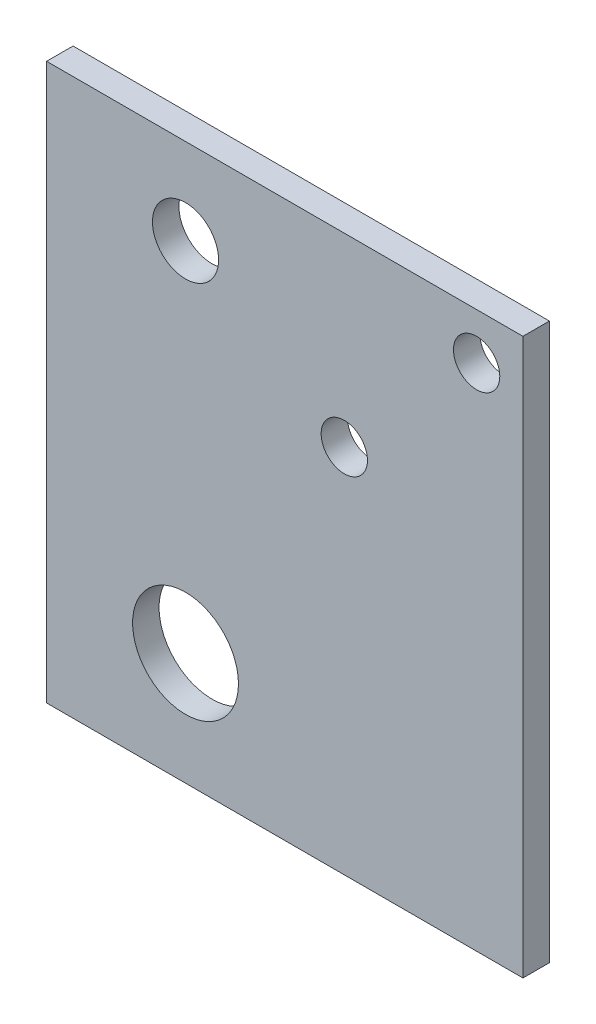
ISO-10303-21;
HEADER;
FILE_DESCRIPTION(('STEP AP214'),'2;1');
FILE_NAME('part.step','',(''),(''),'','','');
FILE_SCHEMA(('AUTOMOTIVE_DESIGN { 1 0 10303 214 1 1 1 1 }'));
ENDSEC;
DATA;
#1=APPLICATION_CONTEXT('core data for automotive mechanical design processes');
#2=APPLICATION_PROTOCOL_DEFINITION('international standard','automotive_design',2000,#1);
#3=PRODUCT_CONTEXT('',#1,'mechanical');
#4=PRODUCT('Part','Part','',(#3));
#5=PRODUCT_RELATED_PRODUCT_CATEGORY('part','',(#4));
#6=PRODUCT_DEFINITION_FORMATION('','',#4);
#7=PRODUCT_DEFINITION_CONTEXT('part definition',#1,'design');
#8=PRODUCT_DEFINITION('design','',#6,#7);
#9=PRODUCT_DEFINITION_SHAPE('','',#8);
#10=(LENGTH_UNIT() NAMED_UNIT(*) SI_UNIT(.MILLI.,.METRE.));
#11=(NAMED_UNIT(*) PLANE_ANGLE_UNIT() SI_UNIT($,.RADIAN.));
#12=(NAMED_UNIT(*) SI_UNIT($,.STERADIAN.) SOLID_ANGLE_UNIT());
#13=UNCERTAINTY_MEASURE_WITH_UNIT(LENGTH_MEASURE(1.E-05),#10,'distance_accuracy_value','');
#14=(GEOMETRIC_REPRESENTATION_CONTEXT(3) GLOBAL_UNCERTAINTY_ASSIGNED_CONTEXT((#13)) GLOBAL_UNIT_ASSIGNED_CONTEXT((#10,
#11,#12)) REPRESENTATION_CONTEXT('',''));
#15=CARTESIAN_POINT('',(0.,0.,0.));
#16=DIRECTION('',(0.,0.,1.));
#17=DIRECTION('',(1.,0.,0.));
#18=AXIS2_PLACEMENT_3D('',#15,#16,#17);
#19=CARTESIAN_POINT('',(0.,0.,2.));
#20=DIRECTION('',(1.,0.,0.));
#21=DIRECTION('',(0.,0.,-1.));
#22=AXIS2_PLACEMENT_3D('',#19,#20,#21);
#23=PLANE('',#22);
#24=DIRECTION('',(0.,-1.,0.));
#25=VECTOR('',#24,1.);
#26=CARTESIAN_POINT('',(0.,0.,0.));
#27=LINE('',#26,#25);
#28=CARTESIAN_POINT('',(0.,42.,0.));
#29=VERTEX_POINT('',#28);
#30=CARTESIAN_POINT('',(0.,0.,0.));
#31=VERTEX_POINT('',#30);
#32=EDGE_CURVE('E95',#29,#31,#27,.T.);
#33=ORIENTED_EDGE('',*,*,#32,.T.);
#34=DIRECTION('',(0.,0.,-1.));
#35=VECTOR('',#34,1.);
#36=CARTESIAN_POINT('',(0.,0.,2.));
#37=LINE('',#36,#35);
#38=CARTESIAN_POINT('',(0.,0.,2.));
#39=VERTEX_POINT('',#38);
#40=EDGE_CURVE('E11',#39,#31,#37,.T.);
#41=ORIENTED_EDGE('',*,*,#40,.F.);
#42=DIRECTION('',(0.,-1.,0.));
#43=VECTOR('',#42,1.);
#44=CARTESIAN_POINT('',(0.,0.,2.));
#45=LINE('',#44,#43);
#46=CARTESIAN_POINT('',(0.,42.,2.));
#47=VERTEX_POINT('',#46);
#48=EDGE_CURVE('E83',#47,#39,#45,.T.);
#49=ORIENTED_EDGE('',*,*,#48,.F.);
#50=DIRECTION('',(0.,0.,-1.));
#51=VECTOR('',#50,1.);
#52=CARTESIAN_POINT('',(0.,42.,2.));
#53=LINE('',#52,#51);
#54=EDGE_CURVE('E91',#47,#29,#53,.T.);
#55=ORIENTED_EDGE('',*,*,#54,.T.);
#56=EDGE_LOOP('',(#33,#41,#49,#55));
#57=FACE_BOUND('',#56,.T.);
#58=ADVANCED_FACE('F32',(#57),#23,.F.);
#59=CARTESIAN_POINT('',(0.,0.,2.));
#60=DIRECTION('',(0.,1.,0.));
#61=DIRECTION('',(0.,0.,1.));
#62=AXIS2_PLACEMENT_3D('',#59,#60,#61);
#63=PLANE('',#62);
#64=DIRECTION('',(1.,0.,0.));
#65=VECTOR('',#64,1.);
#66=CARTESIAN_POINT('',(0.,0.,0.));
#67=LINE('',#66,#65);
#68=CARTESIAN_POINT('',(36.,0.,0.));
#69=VERTEX_POINT('',#68);
#70=EDGE_CURVE('E87',#31,#69,#67,.T.);
#71=ORIENTED_EDGE('',*,*,#70,.T.);
#72=DIRECTION('',(0.,0.,-1.));
#73=VECTOR('',#72,1.);
#74=CARTESIAN_POINT('',(36.,0.,2.));
#75=LINE('',#74,#73);
#76=CARTESIAN_POINT('',(36.,0.,2.));
#77=VERTEX_POINT('',#76);
#78=EDGE_CURVE('E40',#77,#69,#75,.T.);
#79=ORIENTED_EDGE('',*,*,#78,.F.);
#80=DIRECTION('',(1.,0.,0.));
#81=VECTOR('',#80,1.);
#82=CARTESIAN_POINT('',(0.,0.,2.));
#83=LINE('',#82,#81);
#84=EDGE_CURVE('E78',#39,#77,#83,.T.);
#85=ORIENTED_EDGE('',*,*,#84,.F.);
#86=ORIENTED_EDGE('',*,*,#40,.T.);
#87=EDGE_LOOP('',(#71,#79,#85,#86));
#88=FACE_BOUND('',#87,.T.);
#89=ADVANCED_FACE('F86',(#88),#63,.F.);
#90=CARTESIAN_POINT('',(36.,0.,2.));
#91=DIRECTION('',(-1.,0.,0.));
#92=DIRECTION('',(0.,0.,1.));
#93=AXIS2_PLACEMENT_3D('',#90,#91,#92);
#94=PLANE('',#93);
#95=DIRECTION('',(0.,1.,0.));
#96=VECTOR('',#95,1.);
#97=CARTESIAN_POINT('',(36.,0.,0.));
#98=LINE('',#97,#96);
#99=CARTESIAN_POINT('',(36.,42.,0.));
#100=VERTEX_POINT('',#99);
#101=EDGE_CURVE('E65',#69,#100,#98,.T.);
#102=ORIENTED_EDGE('',*,*,#101,.T.);
#103=DIRECTION('',(0.,0.,-1.));
#104=VECTOR('',#103,1.);
#105=CARTESIAN_POINT('',(36.,42.,2.));
#106=LINE('',#105,#104);
#107=CARTESIAN_POINT('',(36.,42.,2.));
#108=VERTEX_POINT('',#107);
#109=EDGE_CURVE('E88',#108,#100,#106,.T.);
#110=ORIENTED_EDGE('',*,*,#109,.F.);
#111=DIRECTION('',(0.,1.,0.));
#112=VECTOR('',#111,1.);
#113=CARTESIAN_POINT('',(36.,0.,2.));
#114=LINE('',#113,#112);
#115=EDGE_CURVE('E81',#77,#108,#114,.T.);
#116=ORIENTED_EDGE('',*,*,#115,.F.);
#117=ORIENTED_EDGE('',*,*,#78,.T.);
#118=EDGE_LOOP('',(#102,#110,#116,#117));
#119=FACE_BOUND('',#118,.T.);
#120=ADVANCED_FACE('F89',(#119),#94,.F.);
#121=CARTESIAN_POINT('',(0.,42.,2.));
#122=DIRECTION('',(0.,-1.,0.));
#123=DIRECTION('',(0.,0.,-1.));
#124=AXIS2_PLACEMENT_3D('',#121,#122,#123);
#125=PLANE('',#124);
#126=DIRECTION('',(-1.,0.,0.));
#127=VECTOR('',#126,1.);
#128=CARTESIAN_POINT('',(0.,42.,0.));
#129=LINE('',#128,#127);
#130=EDGE_CURVE('E71',#100,#29,#129,.T.);
#131=ORIENTED_EDGE('',*,*,#130,.T.);
#132=ORIENTED_EDGE('',*,*,#54,.F.);
#133=DIRECTION('',(-1.,0.,0.));
#134=VECTOR('',#133,1.);
#135=CARTESIAN_POINT('',(0.,42.,2.));
#136=LINE('',#135,#134);
#137=EDGE_CURVE('E48',#108,#47,#136,.T.);
#138=ORIENTED_EDGE('',*,*,#137,.F.);
#139=ORIENTED_EDGE('',*,*,#109,.T.);
#140=EDGE_LOOP('',(#131,#132,#138,#139));
#141=FACE_BOUND('',#140,.T.);
#142=ADVANCED_FACE('F103',(#141),#125,.F.);
#143=CARTESIAN_POINT('',(0.,42.,2.));
#144=DIRECTION('',(0.,0.,-1.));
#145=DIRECTION('',(-1.,0.,0.));
#146=AXIS2_PLACEMENT_3D('',#143,#144,#145);
#147=PLANE('',#146);
#148=CARTESIAN_POINT('',(10.5000000000001,8.49999999999998,2.));
#149=DIRECTION('',(0.,0.,1.));
#150=DIRECTION('',(1.,0.,0.));
#151=AXIS2_PLACEMENT_3D('',#148,#149,#150);
#152=CIRCLE('',#151,4.);
#153=CARTESIAN_POINT('',(14.5000000000001,8.49999999999998,2.));
#154=VERTEX_POINT('',#153);
#155=EDGE_CURVE('E127',#154,#154,#152,.T.);
#156=ORIENTED_EDGE('',*,*,#155,.F.);
#157=EDGE_LOOP('',(#156));
#158=FACE_BOUND('',#157,.T.);
#159=CARTESIAN_POINT('',(10.5000000000001,35.5,2.));
#160=DIRECTION('',(0.,0.,1.));
#161=DIRECTION('',(1.,0.,0.));
#162=AXIS2_PLACEMENT_3D('',#159,#160,#161);
#163=CIRCLE('',#162,2.5);
#164=CARTESIAN_POINT('',(13.0000000000001,35.5,2.));
#165=VERTEX_POINT('',#164);
#166=EDGE_CURVE('E121',#165,#165,#163,.T.);
#167=ORIENTED_EDGE('',*,*,#166,.F.);
#168=EDGE_LOOP('',(#167));
#169=FACE_BOUND('',#168,.T.);
#170=CARTESIAN_POINT('',(22.5,28.,2.));
#171=DIRECTION('',(0.,0.,1.));
#172=DIRECTION('',(1.,0.,0.));
#173=AXIS2_PLACEMENT_3D('',#170,#171,#172);
#174=CIRCLE('',#173,1.75);
#175=CARTESIAN_POINT('',(24.25,28.,2.));
#176=VERTEX_POINT('',#175);
#177=EDGE_CURVE('E115',#176,#176,#174,.T.);
#178=ORIENTED_EDGE('',*,*,#177,.F.);
#179=EDGE_LOOP('',(#178));
#180=FACE_BOUND('',#179,.T.);
#181=CARTESIAN_POINT('',(32.5,38.5,2.));
#182=DIRECTION('',(0.,0.,1.));
#183=DIRECTION('',(1.,0.,0.));
#184=AXIS2_PLACEMENT_3D('',#181,#182,#183);
#185=CIRCLE('',#184,1.75);
#186=CARTESIAN_POINT('',(34.25,38.5,2.));
#187=VERTEX_POINT('',#186);
#188=EDGE_CURVE('E109',#187,#187,#185,.T.);
#189=ORIENTED_EDGE('',*,*,#188,.F.);
#190=EDGE_LOOP('',(#189));
#191=FACE_BOUND('',#190,.T.);
#192=ORIENTED_EDGE('',*,*,#48,.T.);
#193=ORIENTED_EDGE('',*,*,#84,.T.);
#194=ORIENTED_EDGE('',*,*,#115,.T.);
#195=ORIENTED_EDGE('',*,*,#137,.T.);
#196=EDGE_LOOP('',(#192,#193,#194,#195));
#197=FACE_BOUND('',#196,.T.);
#198=ADVANCED_FACE('F79',(#158,#169,#180,#191,#197),#147,.F.);
#199=CARTESIAN_POINT('',(0.,42.,0.));
#200=DIRECTION('',(0.,0.,-1.));
#201=DIRECTION('',(-1.,0.,0.));
#202=AXIS2_PLACEMENT_3D('',#199,#200,#201);
#203=PLANE('',#202);
#204=CARTESIAN_POINT('',(10.5000000000001,8.49999999999998,0.));
#205=DIRECTION('',(0.,0.,1.));
#206=DIRECTION('',(1.,0.,0.));
#207=AXIS2_PLACEMENT_3D('',#204,#205,#206);
#208=CIRCLE('',#207,4.);
#209=CARTESIAN_POINT('',(14.5000000000001,8.49999999999998,0.));
#210=VERTEX_POINT('',#209);
#211=EDGE_CURVE('E124',#210,#210,#208,.T.);
#212=ORIENTED_EDGE('',*,*,#211,.T.);
#213=EDGE_LOOP('',(#212));
#214=FACE_BOUND('',#213,.T.);
#215=CARTESIAN_POINT('',(10.5000000000001,35.5,0.));
#216=DIRECTION('',(0.,0.,1.));
#217=DIRECTION('',(1.,0.,0.));
#218=AXIS2_PLACEMENT_3D('',#215,#216,#217);
#219=CIRCLE('',#218,2.5);
#220=CARTESIAN_POINT('',(13.0000000000001,35.5,0.));
#221=VERTEX_POINT('',#220);
#222=EDGE_CURVE('E118',#221,#221,#219,.T.);
#223=ORIENTED_EDGE('',*,*,#222,.T.);
#224=EDGE_LOOP('',(#223));
#225=FACE_BOUND('',#224,.T.);
#226=CARTESIAN_POINT('',(22.5,28.,0.));
#227=DIRECTION('',(0.,0.,1.));
#228=DIRECTION('',(1.,0.,0.));
#229=AXIS2_PLACEMENT_3D('',#226,#227,#228);
#230=CIRCLE('',#229,1.75);
#231=CARTESIAN_POINT('',(24.25,28.,0.));
#232=VERTEX_POINT('',#231);
#233=EDGE_CURVE('E112',#232,#232,#230,.T.);
#234=ORIENTED_EDGE('',*,*,#233,.T.);
#235=EDGE_LOOP('',(#234));
#236=FACE_BOUND('',#235,.T.);
#237=CARTESIAN_POINT('',(32.5,38.5,0.));
#238=DIRECTION('',(0.,0.,1.));
#239=DIRECTION('',(1.,0.,0.));
#240=AXIS2_PLACEMENT_3D('',#237,#238,#239);
#241=CIRCLE('',#240,1.75);
#242=CARTESIAN_POINT('',(34.25,38.5,0.));
#243=VERTEX_POINT('',#242);
#244=EDGE_CURVE('E98',#243,#243,#241,.T.);
#245=ORIENTED_EDGE('',*,*,#244,.T.);
#246=EDGE_LOOP('',(#245));
#247=FACE_BOUND('',#246,.T.);
#248=ORIENTED_EDGE('',*,*,#32,.F.);
#249=ORIENTED_EDGE('',*,*,#130,.F.);
#250=ORIENTED_EDGE('',*,*,#101,.F.);
#251=ORIENTED_EDGE('',*,*,#70,.F.);
#252=EDGE_LOOP('',(#248,#249,#250,#251));
#253=FACE_BOUND('',#252,.T.);
#254=ADVANCED_FACE('F106',(#214,#225,#236,#247,#253),#203,.T.);
#255=CARTESIAN_POINT('',(32.5,38.5,0.));
#256=DIRECTION('',(0.,0.,1.));
#257=DIRECTION('',(1.,0.,0.));
#258=AXIS2_PLACEMENT_3D('',#255,#256,#257);
#259=CYLINDRICAL_SURFACE('',#258,1.75);
#260=ORIENTED_EDGE('',*,*,#244,.F.);
#261=EDGE_LOOP('',(#260));
#262=FACE_BOUND('',#261,.T.);
#263=ORIENTED_EDGE('',*,*,#188,.T.);
#264=EDGE_LOOP('',(#263));
#265=FACE_BOUND('',#264,.T.);
#266=ADVANCED_FACE('F151',(#262,#265),#259,.F.);
#267=CARTESIAN_POINT('',(22.5,28.,0.));
#268=DIRECTION('',(0.,0.,1.));
#269=DIRECTION('',(1.,0.,0.));
#270=AXIS2_PLACEMENT_3D('',#267,#268,#269);
#271=CYLINDRICAL_SURFACE('',#270,1.75);
#272=ORIENTED_EDGE('',*,*,#233,.F.);
#273=EDGE_LOOP('',(#272));
#274=FACE_BOUND('',#273,.T.);
#275=ORIENTED_EDGE('',*,*,#177,.T.);
#276=EDGE_LOOP('',(#275));
#277=FACE_BOUND('',#276,.T.);
#278=ADVANCED_FACE('F153',(#274,#277),#271,.F.);
#279=CARTESIAN_POINT('',(10.5000000000001,35.5,0.));
#280=DIRECTION('',(0.,0.,1.));
#281=DIRECTION('',(1.,0.,0.));
#282=AXIS2_PLACEMENT_3D('',#279,#280,#281);
#283=CYLINDRICAL_SURFACE('',#282,2.5);
#284=ORIENTED_EDGE('',*,*,#222,.F.);
#285=EDGE_LOOP('',(#284));
#286=FACE_BOUND('',#285,.T.);
#287=ORIENTED_EDGE('',*,*,#166,.T.);
#288=EDGE_LOOP('',(#287));
#289=FACE_BOUND('',#288,.T.);
#290=ADVANCED_FACE('F138',(#286,#289),#283,.F.);
#291=CARTESIAN_POINT('',(10.5000000000001,8.49999999999998,0.));
#292=DIRECTION('',(0.,0.,1.));
#293=DIRECTION('',(1.,0.,0.));
#294=AXIS2_PLACEMENT_3D('',#291,#292,#293);
#295=CYLINDRICAL_SURFACE('',#294,4.);
#296=ORIENTED_EDGE('',*,*,#211,.F.);
#297=EDGE_LOOP('',(#296));
#298=FACE_BOUND('',#297,.T.);
#299=ORIENTED_EDGE('',*,*,#155,.T.);
#300=EDGE_LOOP('',(#299));
#301=FACE_BOUND('',#300,.T.);
#302=ADVANCED_FACE('F135',(#298,#301),#295,.F.);
#303=CLOSED_SHELL('',(#58,#89,#120,#142,#198,#254,#266,#278,#290,#302));
#304=MANIFOLD_SOLID_BREP('B2',#303);
#305=ADVANCED_BREP_SHAPE_REPRESENTATION('',(#18,#304),#14);
#306=SHAPE_DEFINITION_REPRESENTATION(#9,#305);
ENDSEC;
END-ISO-10303-21;
